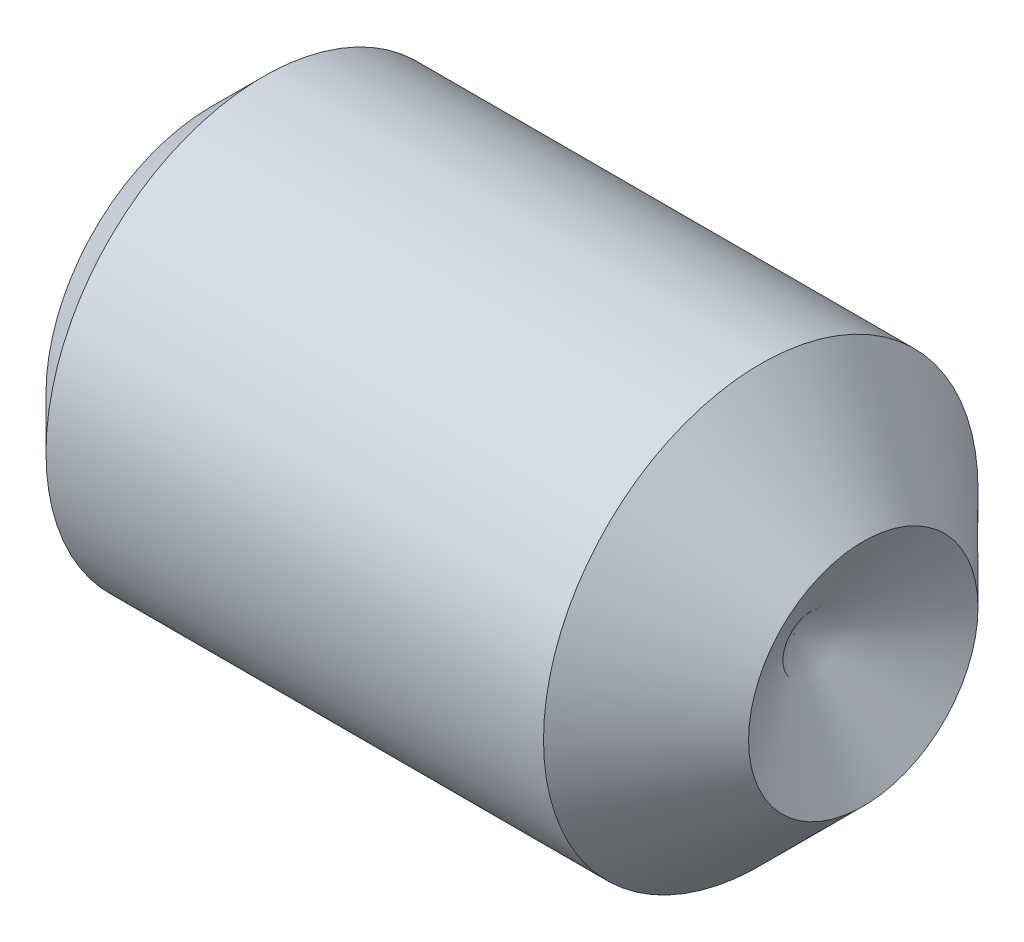
ISO-10303-21;
HEADER;
FILE_DESCRIPTION(('STEP AP214'),'2;1');
FILE_NAME('part.step','',(''),(''),'','','');
FILE_SCHEMA(('AUTOMOTIVE_DESIGN { 1 0 10303 214 1 1 1 1 }'));
ENDSEC;
DATA;
#1=APPLICATION_CONTEXT('core data for automotive mechanical design processes');
#2=APPLICATION_PROTOCOL_DEFINITION('international standard','automotive_design',2000,#1);
#3=PRODUCT_CONTEXT('',#1,'mechanical');
#4=PRODUCT('Part','Part','',(#3));
#5=PRODUCT_RELATED_PRODUCT_CATEGORY('part','',(#4));
#6=PRODUCT_DEFINITION_FORMATION('','',#4);
#7=PRODUCT_DEFINITION_CONTEXT('part definition',#1,'design');
#8=PRODUCT_DEFINITION('design','',#6,#7);
#9=PRODUCT_DEFINITION_SHAPE('','',#8);
#10=(LENGTH_UNIT() NAMED_UNIT(*) SI_UNIT(.MILLI.,.METRE.));
#11=(NAMED_UNIT(*) PLANE_ANGLE_UNIT() SI_UNIT($,.RADIAN.));
#12=(NAMED_UNIT(*) SI_UNIT($,.STERADIAN.) SOLID_ANGLE_UNIT());
#13=UNCERTAINTY_MEASURE_WITH_UNIT(LENGTH_MEASURE(1.E-05),#10,'distance_accuracy_value','');
#14=(GEOMETRIC_REPRESENTATION_CONTEXT(3) GLOBAL_UNCERTAINTY_ASSIGNED_CONTEXT((#13)) GLOBAL_UNIT_ASSIGNED_CONTEXT((#10,
#11,#12)) REPRESENTATION_CONTEXT('',''));
#15=CARTESIAN_POINT('',(0.,0.,0.));
#16=DIRECTION('',(0.,0.,1.));
#17=DIRECTION('',(1.,0.,0.));
#18=AXIS2_PLACEMENT_3D('',#15,#16,#17);
#19=CARTESIAN_POINT('',(-34.9228399577536,0.299488947689497,4.82160447847946));
#20=DIRECTION('',(-1.,0.,0.));
#21=DIRECTION('',(0.,0.,1.));
#22=AXIS2_PLACEMENT_3D('',#19,#20,#21);
#23=PLANE('',#22);
#24=CARTESIAN_POINT('',(-34.9228399577536,0.299488947689497,4.82160447847946));
#25=DIRECTION('',(-1.,0.,0.));
#26=DIRECTION('',(0.,0.,1.));
#27=AXIS2_PLACEMENT_3D('',#24,#25,#26);
#28=CIRCLE('',#27,2.41935);
#29=CARTESIAN_POINT('',(-34.9228399577536,0.299488947689497,7.24095447847946));
#30=VERTEX_POINT('',#29);
#31=EDGE_CURVE('E10',#30,#30,#28,.T.);
#32=ORIENTED_EDGE('',*,*,#31,.T.);
#33=EDGE_LOOP('',(#32));
#34=FACE_BOUND('',#33,.T.);
#35=DIRECTION('',(0.,0.,-1.));
#36=VECTOR('',#35,1.);
#37=CARTESIAN_POINT('',(-34.9228399577536,1.8869889476895,5.73814803081799));
#38=LINE('',#37,#36);
#39=CARTESIAN_POINT('',(-34.9228399577536,1.8869889476895,5.73814803081799));
#40=VERTEX_POINT('',#39);
#41=CARTESIAN_POINT('',(-34.9228399577536,1.8869889476895,3.90506092614093));
#42=VERTEX_POINT('',#41);
#43=EDGE_CURVE('E77',#40,#42,#38,.T.);
#44=ORIENTED_EDGE('',*,*,#43,.F.);
#45=DIRECTION('',(0.,-0.86602540378444,0.499999999999998));
#46=VECTOR('',#45,1.);
#47=CARTESIAN_POINT('',(-34.9228399577536,1.8869889476895,5.73814803081799));
#48=LINE('',#47,#46);
#49=CARTESIAN_POINT('',(-34.9228399577536,0.299488947689497,6.65469158315652));
#50=VERTEX_POINT('',#49);
#51=EDGE_CURVE('E30',#40,#50,#48,.T.);
#52=ORIENTED_EDGE('',*,*,#51,.T.);
#53=DIRECTION('',(0.,0.866025403784439,0.5));
#54=VECTOR('',#53,1.);
#55=CARTESIAN_POINT('',(-34.9228399577536,-1.28801105231051,5.73814803081799));
#56=LINE('',#55,#54);
#57=CARTESIAN_POINT('',(-34.9228399577536,-1.28801105231051,5.73814803081799));
#58=VERTEX_POINT('',#57);
#59=EDGE_CURVE('E83',#58,#50,#56,.T.);
#60=ORIENTED_EDGE('',*,*,#59,.F.);
#61=DIRECTION('',(0.,0.,-1.));
#62=VECTOR('',#61,1.);
#63=CARTESIAN_POINT('',(-34.9228399577536,-1.28801105231051,5.73814803081799));
#64=LINE('',#63,#62);
#65=CARTESIAN_POINT('',(-34.9228399577536,-1.28801105231051,3.90506092614093));
#66=VERTEX_POINT('',#65);
#67=EDGE_CURVE('E103',#58,#66,#64,.T.);
#68=ORIENTED_EDGE('',*,*,#67,.T.);
#69=DIRECTION('',(0.,0.86602540378444,-0.499999999999998));
#70=VECTOR('',#69,1.);
#71=CARTESIAN_POINT('',(-34.9228399577536,-1.28801105231051,3.90506092614093));
#72=LINE('',#71,#70);
#73=CARTESIAN_POINT('',(-34.9228399577536,0.299488947689499,2.9885173738024));
#74=VERTEX_POINT('',#73);
#75=EDGE_CURVE('E106',#66,#74,#72,.T.);
#76=ORIENTED_EDGE('',*,*,#75,.T.);
#77=DIRECTION('',(0.,-0.866025403784439,-0.5));
#78=VECTOR('',#77,1.);
#79=CARTESIAN_POINT('',(-34.9228399577536,1.8869889476895,3.90506092614093));
#80=LINE('',#79,#78);
#81=EDGE_CURVE('E109',#42,#74,#80,.T.);
#82=ORIENTED_EDGE('',*,*,#81,.F.);
#83=EDGE_LOOP('',(#44,#52,#60,#68,#76,#82));
#84=FACE_BOUND('',#83,.T.);
#85=ADVANCED_FACE('F16',(#34,#84),#23,.T.);
#86=CARTESIAN_POINT('',(-34.9228399577536,0.299488947689497,4.82160447847946));
#87=DIRECTION('',(1.,0.,0.));
#88=DIRECTION('',(0.,0.,-1.));
#89=AXIS2_PLACEMENT_3D('',#86,#87,#88);
#90=CONICAL_SURFACE('',#89,2.41935,0.785398163397447);
#91=CARTESIAN_POINT('',(-34.1671899577536,0.299488947689497,4.82160447847946));
#92=DIRECTION('',(-1.,0.,0.));
#93=DIRECTION('',(0.,0.,1.));
#94=AXIS2_PLACEMENT_3D('',#91,#92,#93);
#95=CIRCLE('',#94,3.175);
#96=CARTESIAN_POINT('',(-34.1671899577536,0.299488947689497,7.99660447847946));
#97=VERTEX_POINT('',#96);
#98=EDGE_CURVE('E23',#97,#97,#95,.T.);
#99=ORIENTED_EDGE('',*,*,#98,.T.);
#100=EDGE_LOOP('',(#99));
#101=FACE_BOUND('',#100,.T.);
#102=ORIENTED_EDGE('',*,*,#31,.F.);
#103=EDGE_LOOP('',(#102));
#104=FACE_BOUND('',#103,.T.);
#105=ADVANCED_FACE('F129',(#101,#104),#90,.T.);
#106=CARTESIAN_POINT('',(-47.6228399577536,0.299488947689497,4.82160447847946));
#107=DIRECTION('',(-1.,0.,0.));
#108=DIRECTION('',(0.,0.,1.));
#109=AXIS2_PLACEMENT_3D('',#106,#107,#108);
#110=CYLINDRICAL_SURFACE('',#109,3.175);
#111=CARTESIAN_POINT('',(-26.8964399577536,0.299488947689497,4.82160447847946));
#112=DIRECTION('',(-1.,0.,0.));
#113=DIRECTION('',(0.,0.,1.));
#114=AXIS2_PLACEMENT_3D('',#111,#112,#113);
#115=CIRCLE('',#114,3.175);
#116=CARTESIAN_POINT('',(-26.8964399577536,0.299488947689497,7.99660447847946));
#117=VERTEX_POINT('',#116);
#118=EDGE_CURVE('E124',#117,#117,#115,.T.);
#119=ORIENTED_EDGE('',*,*,#118,.T.);
#120=EDGE_LOOP('',(#119));
#121=FACE_BOUND('',#120,.T.);
#122=ORIENTED_EDGE('',*,*,#98,.F.);
#123=EDGE_LOOP('',(#122));
#124=FACE_BOUND('',#123,.T.);
#125=ADVANCED_FACE('F132',(#121,#124),#110,.T.);
#126=CARTESIAN_POINT('',(-26.8964399577536,0.299488947689497,4.82160447847946));
#127=DIRECTION('',(-1.,0.,0.));
#128=DIRECTION('',(0.,0.,1.));
#129=AXIS2_PLACEMENT_3D('',#126,#127,#128);
#130=CONICAL_SURFACE('',#129,3.175,0.785398163397452);
#131=CARTESIAN_POINT('',(-25.3978399577536,0.299488947689497,4.82160447847946));
#132=DIRECTION('',(-1.,0.,0.));
#133=DIRECTION('',(0.,0.,1.));
#134=AXIS2_PLACEMENT_3D('',#131,#132,#133);
#135=CIRCLE('',#134,1.6764);
#136=CARTESIAN_POINT('',(-25.3978399577536,0.299488947689497,6.49800447847946));
#137=VERTEX_POINT('',#136);
#138=EDGE_CURVE('E84',#137,#137,#135,.T.);
#139=ORIENTED_EDGE('',*,*,#138,.T.);
#140=EDGE_LOOP('',(#139));
#141=FACE_BOUND('',#140,.T.);
#142=ORIENTED_EDGE('',*,*,#118,.F.);
#143=EDGE_LOOP('',(#142));
#144=FACE_BOUND('',#143,.T.);
#145=ADVANCED_FACE('F134',(#141,#144),#130,.T.);
#146=CARTESIAN_POINT('',(-26.4051226994914,0.299488947689497,4.82160447847946));
#147=DIRECTION('',(1.,0.,0.));
#148=DIRECTION('',(0.,0.,-1.));
#149=AXIS2_PLACEMENT_3D('',#146,#147,#148);
#150=CONICAL_SURFACE('',#149,0.,1.02974425867666);
#151=ORIENTED_EDGE('',*,*,#138,.F.);
#152=EDGE_LOOP('',(#151));
#153=FACE_BOUND('',#152,.T.);
#154=CARTESIAN_POINT('',(-26.4051226994914,0.299488947689497,4.82160447847946));
#155=VERTEX_POINT('',#154);
#156=VERTEX_LOOP('',#155);
#157=FACE_BOUND('',#156,.T.);
#158=ADVANCED_FACE('F142',(#153,#157),#150,.F.);
#159=CARTESIAN_POINT('',(-31.7478399577536,1.8869889476895,5.73814803081799));
#160=DIRECTION('',(0.,-0.499999999999998,-0.86602540378444));
#161=DIRECTION('',(0.,0.86602540378444,-0.499999999999998));
#162=AXIS2_PLACEMENT_3D('',#159,#160,#161);
#163=PLANE('',#162);
#164=ORIENTED_EDGE('',*,*,#51,.F.);
#165=DIRECTION('',(-1.,0.,0.));
#166=VECTOR('',#165,1.);
#167=CARTESIAN_POINT('',(-31.7478399577536,1.8869889476895,5.73814803081799));
#168=LINE('',#167,#166);
#169=CARTESIAN_POINT('',(-31.7478399577536,1.8869889476895,5.73814803081799));
#170=VERTEX_POINT('',#169);
#171=EDGE_CURVE('E71',#170,#40,#168,.T.);
#172=ORIENTED_EDGE('',*,*,#171,.F.);
#173=DIRECTION('',(0.,-0.86602540378444,0.499999999999998));
#174=VECTOR('',#173,1.);
#175=CARTESIAN_POINT('',(-31.7478399577536,1.8869889476895,5.73814803081799));
#176=LINE('',#175,#174);
#177=CARTESIAN_POINT('',(-31.7478399577536,0.299488947689497,6.65469158315652));
#178=VERTEX_POINT('',#177);
#179=EDGE_CURVE('E66',#170,#178,#176,.T.);
#180=ORIENTED_EDGE('',*,*,#179,.T.);
#181=DIRECTION('',(-1.,0.,0.));
#182=VECTOR('',#181,1.);
#183=CARTESIAN_POINT('',(-31.7478399577536,0.299488947689497,6.65469158315652));
#184=LINE('',#183,#182);
#185=EDGE_CURVE('E69',#178,#50,#184,.T.);
#186=ORIENTED_EDGE('',*,*,#185,.T.);
#187=EDGE_LOOP('',(#164,#172,#180,#186));
#188=FACE_BOUND('',#187,.T.);
#189=ADVANCED_FACE('F68',(#188),#163,.T.);
#190=CARTESIAN_POINT('',(-31.7478399577536,-1.28801105231051,5.73814803081799));
#191=DIRECTION('',(0.,-0.5,0.866025403784439));
#192=DIRECTION('',(0.,-0.866025403784439,-0.5));
#193=AXIS2_PLACEMENT_3D('',#190,#191,#192);
#194=PLANE('',#193);
#195=ORIENTED_EDGE('',*,*,#59,.T.);
#196=ORIENTED_EDGE('',*,*,#185,.F.);
#197=DIRECTION('',(0.,0.866025403784439,0.5));
#198=VECTOR('',#197,1.);
#199=CARTESIAN_POINT('',(-31.7478399577536,-1.28801105231051,5.73814803081799));
#200=LINE('',#199,#198);
#201=CARTESIAN_POINT('',(-31.7478399577536,-1.28801105231051,5.73814803081799));
#202=VERTEX_POINT('',#201);
#203=EDGE_CURVE('E76',#202,#178,#200,.T.);
#204=ORIENTED_EDGE('',*,*,#203,.F.);
#205=DIRECTION('',(-1.,0.,0.));
#206=VECTOR('',#205,1.);
#207=CARTESIAN_POINT('',(-31.7478399577536,-1.28801105231051,5.73814803081799));
#208=LINE('',#207,#206);
#209=EDGE_CURVE('E85',#202,#58,#208,.T.);
#210=ORIENTED_EDGE('',*,*,#209,.T.);
#211=EDGE_LOOP('',(#195,#196,#204,#210));
#212=FACE_BOUND('',#211,.T.);
#213=ADVANCED_FACE('F81',(#212),#194,.F.);
#214=CARTESIAN_POINT('',(-31.7478399577536,-1.28801105231051,5.73814803081799));
#215=DIRECTION('',(0.,1.,0.));
#216=DIRECTION('',(0.,0.,1.));
#217=AXIS2_PLACEMENT_3D('',#214,#215,#216);
#218=PLANE('',#217);
#219=ORIENTED_EDGE('',*,*,#67,.F.);
#220=ORIENTED_EDGE('',*,*,#209,.F.);
#221=DIRECTION('',(0.,0.,-1.));
#222=VECTOR('',#221,1.);
#223=CARTESIAN_POINT('',(-31.7478399577536,-1.28801105231051,5.73814803081799));
#224=LINE('',#223,#222);
#225=CARTESIAN_POINT('',(-31.7478399577536,-1.28801105231051,3.90506092614093));
#226=VERTEX_POINT('',#225);
#227=EDGE_CURVE('E90',#202,#226,#224,.T.);
#228=ORIENTED_EDGE('',*,*,#227,.T.);
#229=DIRECTION('',(-1.,0.,0.));
#230=VECTOR('',#229,1.);
#231=CARTESIAN_POINT('',(-31.7478399577536,-1.28801105231051,3.90506092614093));
#232=LINE('',#231,#230);
#233=EDGE_CURVE('E119',#226,#66,#232,.T.);
#234=ORIENTED_EDGE('',*,*,#233,.T.);
#235=EDGE_LOOP('',(#219,#220,#228,#234));
#236=FACE_BOUND('',#235,.T.);
#237=ADVANCED_FACE('F165',(#236),#218,.T.);
#238=CARTESIAN_POINT('',(-31.7478399577536,-1.28801105231051,3.90506092614093));
#239=DIRECTION('',(0.,0.499999999999998,0.86602540378444));
#240=DIRECTION('',(0.,-0.86602540378444,0.499999999999998));
#241=AXIS2_PLACEMENT_3D('',#238,#239,#240);
#242=PLANE('',#241);
#243=ORIENTED_EDGE('',*,*,#75,.F.);
#244=ORIENTED_EDGE('',*,*,#233,.F.);
#245=DIRECTION('',(0.,0.86602540378444,-0.499999999999998));
#246=VECTOR('',#245,1.);
#247=CARTESIAN_POINT('',(-31.7478399577536,-1.28801105231051,3.90506092614093));
#248=LINE('',#247,#246);
#249=CARTESIAN_POINT('',(-31.7478399577536,0.299488947689499,2.9885173738024));
#250=VERTEX_POINT('',#249);
#251=EDGE_CURVE('E92',#226,#250,#248,.T.);
#252=ORIENTED_EDGE('',*,*,#251,.T.);
#253=DIRECTION('',(-1.,0.,0.));
#254=VECTOR('',#253,1.);
#255=CARTESIAN_POINT('',(-31.7478399577536,0.299488947689499,2.9885173738024));
#256=LINE('',#255,#254);
#257=EDGE_CURVE('E117',#250,#74,#256,.T.);
#258=ORIENTED_EDGE('',*,*,#257,.T.);
#259=EDGE_LOOP('',(#243,#244,#252,#258));
#260=FACE_BOUND('',#259,.T.);
#261=ADVANCED_FACE('F161',(#260),#242,.T.);
#262=CARTESIAN_POINT('',(-31.7478399577536,1.8869889476895,3.90506092614093));
#263=DIRECTION('',(0.,0.5,-0.866025403784439));
#264=DIRECTION('',(0.,0.866025403784439,0.5));
#265=AXIS2_PLACEMENT_3D('',#262,#263,#264);
#266=PLANE('',#265);
#267=ORIENTED_EDGE('',*,*,#81,.T.);
#268=ORIENTED_EDGE('',*,*,#257,.F.);
#269=DIRECTION('',(0.,-0.866025403784439,-0.5));
#270=VECTOR('',#269,1.);
#271=CARTESIAN_POINT('',(-31.7478399577536,1.8869889476895,3.90506092614093));
#272=LINE('',#271,#270);
#273=CARTESIAN_POINT('',(-31.7478399577536,1.8869889476895,3.90506092614093));
#274=VERTEX_POINT('',#273);
#275=EDGE_CURVE('E96',#274,#250,#272,.T.);
#276=ORIENTED_EDGE('',*,*,#275,.F.);
#277=DIRECTION('',(-1.,0.,0.));
#278=VECTOR('',#277,1.);
#279=CARTESIAN_POINT('',(-31.7478399577536,1.8869889476895,3.90506092614093));
#280=LINE('',#279,#278);
#281=EDGE_CURVE('E115',#274,#42,#280,.T.);
#282=ORIENTED_EDGE('',*,*,#281,.T.);
#283=EDGE_LOOP('',(#267,#268,#276,#282));
#284=FACE_BOUND('',#283,.T.);
#285=ADVANCED_FACE('F158',(#284),#266,.F.);
#286=CARTESIAN_POINT('',(-31.7478399577536,1.8869889476895,5.73814803081799));
#287=DIRECTION('',(0.,1.,0.));
#288=DIRECTION('',(0.,0.,1.));
#289=AXIS2_PLACEMENT_3D('',#286,#287,#288);
#290=PLANE('',#289);
#291=ORIENTED_EDGE('',*,*,#43,.T.);
#292=ORIENTED_EDGE('',*,*,#281,.F.);
#293=DIRECTION('',(0.,0.,-1.));
#294=VECTOR('',#293,1.);
#295=CARTESIAN_POINT('',(-31.7478399577536,1.8869889476895,5.73814803081799));
#296=LINE('',#295,#294);
#297=EDGE_CURVE('E99',#170,#274,#296,.T.);
#298=ORIENTED_EDGE('',*,*,#297,.F.);
#299=ORIENTED_EDGE('',*,*,#171,.T.);
#300=EDGE_LOOP('',(#291,#292,#298,#299));
#301=FACE_BOUND('',#300,.T.);
#302=ADVANCED_FACE('F154',(#301),#290,.F.);
#303=CARTESIAN_POINT('',(-31.7478399577536,1.8869889476895,5.73814803081799));
#304=DIRECTION('',(1.,0.,0.));
#305=DIRECTION('',(0.,0.,-1.));
#306=AXIS2_PLACEMENT_3D('',#303,#304,#305);
#307=PLANE('',#306);
#308=ORIENTED_EDGE('',*,*,#179,.F.);
#309=ORIENTED_EDGE('',*,*,#297,.T.);
#310=ORIENTED_EDGE('',*,*,#275,.T.);
#311=ORIENTED_EDGE('',*,*,#251,.F.);
#312=ORIENTED_EDGE('',*,*,#227,.F.);
#313=ORIENTED_EDGE('',*,*,#203,.T.);
#314=EDGE_LOOP('',(#308,#309,#310,#311,#312,#313));
#315=FACE_BOUND('',#314,.T.);
#316=ADVANCED_FACE('F88',(#315),#307,.F.);
#317=CLOSED_SHELL('',(#85,#105,#125,#145,#158,#189,#213,#237,#261,#285,#302,#316));
#318=MANIFOLD_SOLID_BREP('B1',#317);
#319=ADVANCED_BREP_SHAPE_REPRESENTATION('',(#18,#318),#14);
#320=SHAPE_DEFINITION_REPRESENTATION(#9,#319);
ENDSEC;
END-ISO-10303-21;
